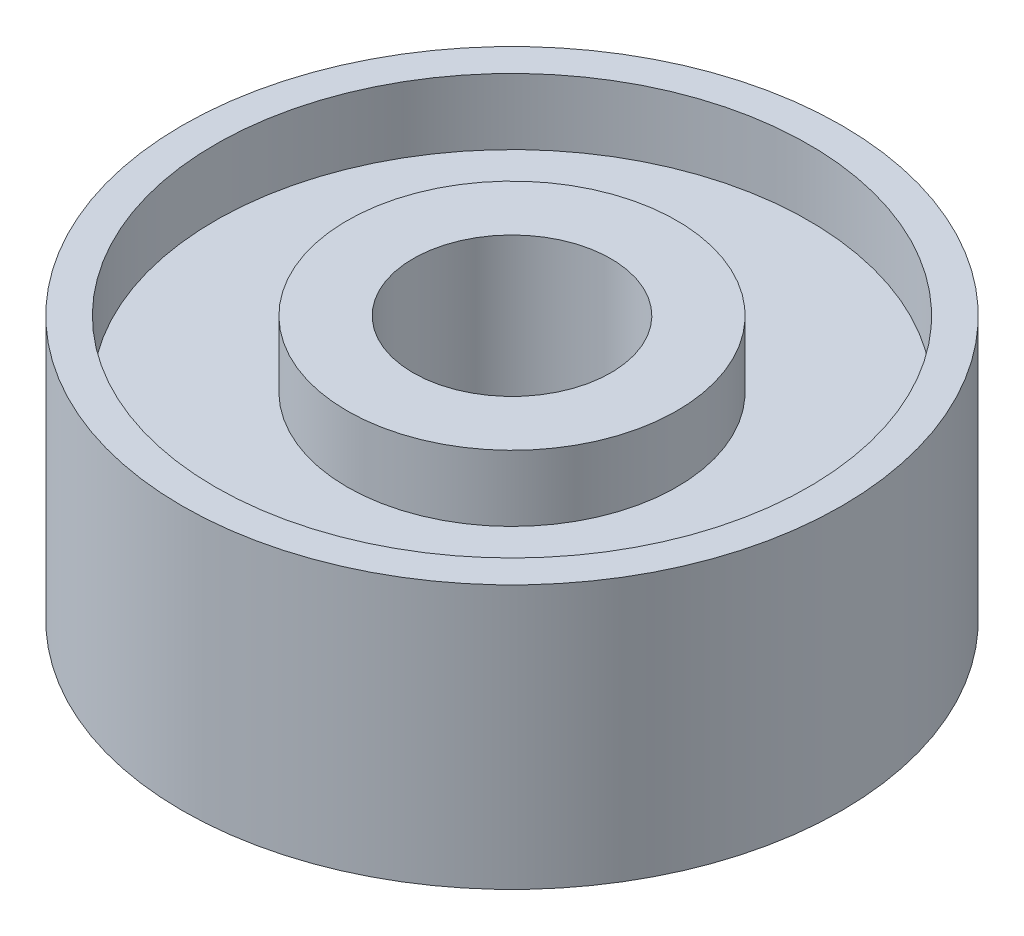
ISO-10303-21;
HEADER;
FILE_DESCRIPTION(('STEP AP214'),'2;1');
FILE_NAME('part.step','',(''),(''),'','','');
FILE_SCHEMA(('AUTOMOTIVE_DESIGN { 1 0 10303 214 1 1 1 1 }'));
ENDSEC;
DATA;
#1=APPLICATION_CONTEXT('core data for automotive mechanical design processes');
#2=APPLICATION_PROTOCOL_DEFINITION('international standard','automotive_design',2000,#1);
#3=PRODUCT_CONTEXT('',#1,'mechanical');
#4=PRODUCT('Part','Part','',(#3));
#5=PRODUCT_RELATED_PRODUCT_CATEGORY('part','',(#4));
#6=PRODUCT_DEFINITION_FORMATION('','',#4);
#7=PRODUCT_DEFINITION_CONTEXT('part definition',#1,'design');
#8=PRODUCT_DEFINITION('design','',#6,#7);
#9=PRODUCT_DEFINITION_SHAPE('','',#8);
#10=(LENGTH_UNIT() NAMED_UNIT(*) SI_UNIT(.MILLI.,.METRE.));
#11=(NAMED_UNIT(*) PLANE_ANGLE_UNIT() SI_UNIT($,.RADIAN.));
#12=(NAMED_UNIT(*) SI_UNIT($,.STERADIAN.) SOLID_ANGLE_UNIT());
#13=UNCERTAINTY_MEASURE_WITH_UNIT(LENGTH_MEASURE(1.E-05),#10,'distance_accuracy_value','');
#14=(GEOMETRIC_REPRESENTATION_CONTEXT(3) GLOBAL_UNCERTAINTY_ASSIGNED_CONTEXT((#13)) GLOBAL_UNIT_ASSIGNED_CONTEXT((#10,
#11,#12)) REPRESENTATION_CONTEXT('',''));
#15=CARTESIAN_POINT('',(0.,0.,0.));
#16=DIRECTION('',(0.,0.,1.));
#17=DIRECTION('',(1.,0.,0.));
#18=AXIS2_PLACEMENT_3D('',#15,#16,#17);
#19=CARTESIAN_POINT('',(0.,0.,0.));
#20=DIRECTION('',(0.,1.,0.));
#21=DIRECTION('',(0.,0.,1.));
#22=AXIS2_PLACEMENT_3D('',#19,#20,#21);
#23=PLANE('',#22);
#24=CARTESIAN_POINT('',(0.,0.,0.));
#25=DIRECTION('',(0.,1.,0.));
#26=DIRECTION('',(0.,0.,1.));
#27=AXIS2_PLACEMENT_3D('',#24,#25,#26);
#28=CIRCLE('',#27,1.5);
#29=CARTESIAN_POINT('',(0.,0.,1.5));
#30=VERTEX_POINT('',#29);
#31=EDGE_CURVE('E46',#30,#30,#28,.T.);
#32=ORIENTED_EDGE('',*,*,#31,.T.);
#33=EDGE_LOOP('',(#32));
#34=FACE_BOUND('',#33,.T.);
#35=CARTESIAN_POINT('',(0.,0.,0.));
#36=DIRECTION('',(0.,-1.,0.));
#37=DIRECTION('',(0.,0.,-1.));
#38=AXIS2_PLACEMENT_3D('',#35,#36,#37);
#39=CIRCLE('',#38,2.5);
#40=CARTESIAN_POINT('',(0.,0.,-2.5));
#41=VERTEX_POINT('',#40);
#42=EDGE_CURVE('E70',#41,#41,#39,.T.);
#43=ORIENTED_EDGE('',*,*,#42,.T.);
#44=EDGE_LOOP('',(#43));
#45=FACE_BOUND('',#44,.T.);
#46=ADVANCED_FACE('F33',(#34,#45),#23,.F.);
#47=CARTESIAN_POINT('',(0.,4.,0.));
#48=DIRECTION('',(0.,1.,0.));
#49=DIRECTION('',(0.,0.,1.));
#50=AXIS2_PLACEMENT_3D('',#47,#48,#49);
#51=PLANE('',#50);
#52=CARTESIAN_POINT('',(0.,4.,0.));
#53=DIRECTION('',(0.,1.,0.));
#54=DIRECTION('',(0.,0.,1.));
#55=AXIS2_PLACEMENT_3D('',#52,#53,#54);
#56=CIRCLE('',#55,1.5);
#57=CARTESIAN_POINT('',(0.,4.,1.5));
#58=VERTEX_POINT('',#57);
#59=EDGE_CURVE('E44',#58,#58,#56,.T.);
#60=ORIENTED_EDGE('',*,*,#59,.F.);
#61=EDGE_LOOP('',(#60));
#62=FACE_BOUND('',#61,.T.);
#63=CARTESIAN_POINT('',(0.,4.,0.));
#64=DIRECTION('',(0.,1.,0.));
#65=DIRECTION('',(0.,0.,1.));
#66=AXIS2_PLACEMENT_3D('',#63,#64,#65);
#67=CIRCLE('',#66,2.5);
#68=CARTESIAN_POINT('',(0.,4.,2.5));
#69=VERTEX_POINT('',#68);
#70=EDGE_CURVE('E58',#69,#69,#67,.T.);
#71=ORIENTED_EDGE('',*,*,#70,.T.);
#72=EDGE_LOOP('',(#71));
#73=FACE_BOUND('',#72,.T.);
#74=ADVANCED_FACE('F109',(#62,#73),#51,.T.);
#75=CARTESIAN_POINT('',(0.,4.,0.));
#76=DIRECTION('',(0.,1.,0.));
#77=DIRECTION('',(0.,0.,1.));
#78=AXIS2_PLACEMENT_3D('',#75,#76,#77);
#79=CIRCLE('',#78,4.5);
#80=CARTESIAN_POINT('',(0.,4.,4.5));
#81=VERTEX_POINT('',#80);
#82=EDGE_CURVE('E52',#81,#81,#79,.T.);
#83=ORIENTED_EDGE('',*,*,#82,.F.);
#84=EDGE_LOOP('',(#83));
#85=FACE_BOUND('',#84,.T.);
#86=CARTESIAN_POINT('',(0.,4.,0.));
#87=DIRECTION('',(0.,1.,0.));
#88=DIRECTION('',(0.,0.,1.));
#89=AXIS2_PLACEMENT_3D('',#86,#87,#88);
#90=CIRCLE('',#89,5.);
#91=CARTESIAN_POINT('',(0.,4.,5.));
#92=VERTEX_POINT('',#91);
#93=EDGE_CURVE('E10',#92,#92,#90,.T.);
#94=ORIENTED_EDGE('',*,*,#93,.T.);
#95=EDGE_LOOP('',(#94));
#96=FACE_BOUND('',#95,.T.);
#97=ADVANCED_FACE('F95',(#85,#96),#51,.T.);
#98=CARTESIAN_POINT('',(0.,0.,0.));
#99=DIRECTION('',(0.,-1.,0.));
#100=DIRECTION('',(0.,0.,-1.));
#101=AXIS2_PLACEMENT_3D('',#98,#99,#100);
#102=CIRCLE('',#101,4.5);
#103=CARTESIAN_POINT('',(0.,0.,-4.5));
#104=VERTEX_POINT('',#103);
#105=EDGE_CURVE('E64',#104,#104,#102,.T.);
#106=ORIENTED_EDGE('',*,*,#105,.F.);
#107=EDGE_LOOP('',(#106));
#108=FACE_BOUND('',#107,.T.);
#109=CARTESIAN_POINT('',(0.,0.,0.));
#110=DIRECTION('',(0.,1.,0.));
#111=DIRECTION('',(0.,0.,1.));
#112=AXIS2_PLACEMENT_3D('',#109,#110,#111);
#113=CIRCLE('',#112,5.);
#114=CARTESIAN_POINT('',(0.,0.,5.));
#115=VERTEX_POINT('',#114);
#116=EDGE_CURVE('E37',#115,#115,#113,.T.);
#117=ORIENTED_EDGE('',*,*,#116,.F.);
#118=EDGE_LOOP('',(#117));
#119=FACE_BOUND('',#118,.T.);
#120=ADVANCED_FACE('F92',(#108,#119),#23,.F.);
#121=CARTESIAN_POINT('',(0.,4.,0.));
#122=DIRECTION('',(0.,-1.,0.));
#123=DIRECTION('',(0.,0.,-1.));
#124=AXIS2_PLACEMENT_3D('',#121,#122,#123);
#125=CYLINDRICAL_SURFACE('',#124,5.);
#126=ORIENTED_EDGE('',*,*,#93,.F.);
#127=EDGE_LOOP('',(#126));
#128=FACE_BOUND('',#127,.T.);
#129=ORIENTED_EDGE('',*,*,#116,.T.);
#130=EDGE_LOOP('',(#129));
#131=FACE_BOUND('',#130,.T.);
#132=ADVANCED_FACE('F35',(#128,#131),#125,.T.);
#133=CARTESIAN_POINT('',(0.,4.,0.));
#134=DIRECTION('',(0.,-1.,0.));
#135=DIRECTION('',(0.,0.,-1.));
#136=AXIS2_PLACEMENT_3D('',#133,#134,#135);
#137=CYLINDRICAL_SURFACE('',#136,1.5);
#138=ORIENTED_EDGE('',*,*,#59,.T.);
#139=EDGE_LOOP('',(#138));
#140=FACE_BOUND('',#139,.T.);
#141=ORIENTED_EDGE('',*,*,#31,.F.);
#142=EDGE_LOOP('',(#141));
#143=FACE_BOUND('',#142,.T.);
#144=ADVANCED_FACE('F99',(#140,#143),#137,.F.);
#145=CARTESIAN_POINT('',(0.,3.,0.));
#146=DIRECTION('',(0.,1.,0.));
#147=DIRECTION('',(0.,0.,1.));
#148=AXIS2_PLACEMENT_3D('',#145,#146,#147);
#149=CYLINDRICAL_SURFACE('',#148,4.5);
#150=CARTESIAN_POINT('',(0.,3.,0.));
#151=DIRECTION('',(0.,1.,0.));
#152=DIRECTION('',(0.,0.,1.));
#153=AXIS2_PLACEMENT_3D('',#150,#151,#152);
#154=CIRCLE('',#153,4.5);
#155=CARTESIAN_POINT('',(0.,3.,4.5));
#156=VERTEX_POINT('',#155);
#157=EDGE_CURVE('E49',#156,#156,#154,.T.);
#158=ORIENTED_EDGE('',*,*,#157,.F.);
#159=EDGE_LOOP('',(#158));
#160=FACE_BOUND('',#159,.T.);
#161=ORIENTED_EDGE('',*,*,#82,.T.);
#162=EDGE_LOOP('',(#161));
#163=FACE_BOUND('',#162,.T.);
#164=ADVANCED_FACE('F105',(#160,#163),#149,.F.);
#165=CARTESIAN_POINT('',(0.,3.,0.));
#166=DIRECTION('',(0.,1.,0.));
#167=DIRECTION('',(0.,0.,1.));
#168=AXIS2_PLACEMENT_3D('',#165,#166,#167);
#169=PLANE('',#168);
#170=CARTESIAN_POINT('',(0.,3.,0.));
#171=DIRECTION('',(0.,1.,0.));
#172=DIRECTION('',(0.,0.,1.));
#173=AXIS2_PLACEMENT_3D('',#170,#171,#172);
#174=CIRCLE('',#173,2.5);
#175=CARTESIAN_POINT('',(0.,3.,2.5));
#176=VERTEX_POINT('',#175);
#177=EDGE_CURVE('E55',#176,#176,#174,.T.);
#178=ORIENTED_EDGE('',*,*,#177,.F.);
#179=EDGE_LOOP('',(#178));
#180=FACE_BOUND('',#179,.T.);
#181=ORIENTED_EDGE('',*,*,#157,.T.);
#182=EDGE_LOOP('',(#181));
#183=FACE_BOUND('',#182,.T.);
#184=ADVANCED_FACE('F123',(#180,#183),#169,.T.);
#185=CARTESIAN_POINT('',(0.,3.,0.));
#186=DIRECTION('',(0.,1.,0.));
#187=DIRECTION('',(0.,0.,1.));
#188=AXIS2_PLACEMENT_3D('',#185,#186,#187);
#189=CYLINDRICAL_SURFACE('',#188,2.5);
#190=ORIENTED_EDGE('',*,*,#177,.T.);
#191=EDGE_LOOP('',(#190));
#192=FACE_BOUND('',#191,.T.);
#193=ORIENTED_EDGE('',*,*,#70,.F.);
#194=EDGE_LOOP('',(#193));
#195=FACE_BOUND('',#194,.T.);
#196=ADVANCED_FACE('F88',(#192,#195),#189,.T.);
#197=CARTESIAN_POINT('',(0.,1.,0.));
#198=DIRECTION('',(0.,-1.,0.));
#199=DIRECTION('',(0.,0.,-1.));
#200=AXIS2_PLACEMENT_3D('',#197,#198,#199);
#201=CYLINDRICAL_SURFACE('',#200,4.5);
#202=CARTESIAN_POINT('',(0.,1.,0.));
#203=DIRECTION('',(0.,-1.,0.));
#204=DIRECTION('',(0.,0.,-1.));
#205=AXIS2_PLACEMENT_3D('',#202,#203,#204);
#206=CIRCLE('',#205,4.5);
#207=CARTESIAN_POINT('',(0.,1.,-4.5));
#208=VERTEX_POINT('',#207);
#209=EDGE_CURVE('E61',#208,#208,#206,.T.);
#210=ORIENTED_EDGE('',*,*,#209,.F.);
#211=EDGE_LOOP('',(#210));
#212=FACE_BOUND('',#211,.T.);
#213=ORIENTED_EDGE('',*,*,#105,.T.);
#214=EDGE_LOOP('',(#213));
#215=FACE_BOUND('',#214,.T.);
#216=ADVANCED_FACE('F82',(#212,#215),#201,.F.);
#217=CARTESIAN_POINT('',(0.,1.,0.));
#218=DIRECTION('',(0.,-1.,0.));
#219=DIRECTION('',(0.,0.,-1.));
#220=AXIS2_PLACEMENT_3D('',#217,#218,#219);
#221=PLANE('',#220);
#222=CARTESIAN_POINT('',(0.,1.,0.));
#223=DIRECTION('',(0.,-1.,0.));
#224=DIRECTION('',(0.,0.,-1.));
#225=AXIS2_PLACEMENT_3D('',#222,#223,#224);
#226=CIRCLE('',#225,2.5);
#227=CARTESIAN_POINT('',(0.,1.,-2.5));
#228=VERTEX_POINT('',#227);
#229=EDGE_CURVE('E67',#228,#228,#226,.T.);
#230=ORIENTED_EDGE('',*,*,#229,.F.);
#231=EDGE_LOOP('',(#230));
#232=FACE_BOUND('',#231,.T.);
#233=ORIENTED_EDGE('',*,*,#209,.T.);
#234=EDGE_LOOP('',(#233));
#235=FACE_BOUND('',#234,.T.);
#236=ADVANCED_FACE('F79',(#232,#235),#221,.T.);
#237=CARTESIAN_POINT('',(0.,1.,0.));
#238=DIRECTION('',(0.,-1.,0.));
#239=DIRECTION('',(0.,0.,-1.));
#240=AXIS2_PLACEMENT_3D('',#237,#238,#239);
#241=CYLINDRICAL_SURFACE('',#240,2.5);
#242=ORIENTED_EDGE('',*,*,#229,.T.);
#243=EDGE_LOOP('',(#242));
#244=FACE_BOUND('',#243,.T.);
#245=ORIENTED_EDGE('',*,*,#42,.F.);
#246=EDGE_LOOP('',(#245));
#247=FACE_BOUND('',#246,.T.);
#248=ADVANCED_FACE('F76',(#244,#247),#241,.T.);
#249=CLOSED_SHELL('',(#46,#74,#97,#120,#132,#144,#164,#184,#196,#216,#236,#248));
#250=MANIFOLD_SOLID_BREP('B2',#249);
#251=ADVANCED_BREP_SHAPE_REPRESENTATION('',(#18,#250),#14);
#252=SHAPE_DEFINITION_REPRESENTATION(#9,#251);
ENDSEC;
END-ISO-10303-21;
